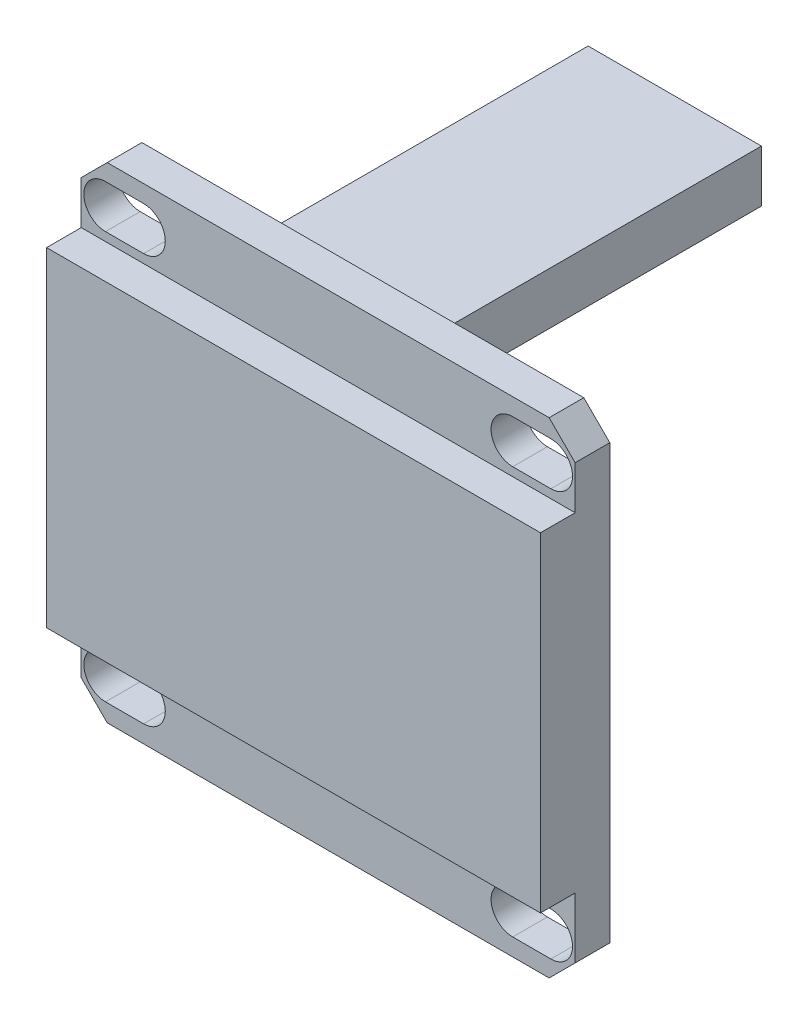
ISO-10303-21;
HEADER;
FILE_DESCRIPTION(('STEP AP214'),'2;1');
FILE_NAME('part.step','',(''),(''),'','','');
FILE_SCHEMA(('AUTOMOTIVE_DESIGN { 1 0 10303 214 1 1 1 1 }'));
ENDSEC;
DATA;
#1=APPLICATION_CONTEXT('core data for automotive mechanical design processes');
#2=APPLICATION_PROTOCOL_DEFINITION('international standard','automotive_design',2000,#1);
#3=PRODUCT_CONTEXT('',#1,'mechanical');
#4=PRODUCT('Part','Part','',(#3));
#5=PRODUCT_RELATED_PRODUCT_CATEGORY('part','',(#4));
#6=PRODUCT_DEFINITION_FORMATION('','',#4);
#7=PRODUCT_DEFINITION_CONTEXT('part definition',#1,'design');
#8=PRODUCT_DEFINITION('design','',#6,#7);
#9=PRODUCT_DEFINITION_SHAPE('','',#8);
#10=(LENGTH_UNIT() NAMED_UNIT(*) SI_UNIT(.MILLI.,.METRE.));
#11=(NAMED_UNIT(*) PLANE_ANGLE_UNIT() SI_UNIT($,.RADIAN.));
#12=(NAMED_UNIT(*) SI_UNIT($,.STERADIAN.) SOLID_ANGLE_UNIT());
#13=UNCERTAINTY_MEASURE_WITH_UNIT(LENGTH_MEASURE(1.E-05),#10,'distance_accuracy_value','');
#14=(GEOMETRIC_REPRESENTATION_CONTEXT(3) GLOBAL_UNCERTAINTY_ASSIGNED_CONTEXT((#13)) GLOBAL_UNIT_ASSIGNED_CONTEXT((#10,
#11,#12)) REPRESENTATION_CONTEXT('',''));
#15=CARTESIAN_POINT('',(0.,0.,0.));
#16=DIRECTION('',(0.,0.,1.));
#17=DIRECTION('',(1.,0.,0.));
#18=AXIS2_PLACEMENT_3D('',#15,#16,#17);
#19=CARTESIAN_POINT('',(-25.2500001639128,5.36363649774681,0.));
#20=DIRECTION('',(0.,0.,1.));
#21=DIRECTION('',(1.,0.,0.));
#22=AXIS2_PLACEMENT_3D('',#19,#20,#21);
#23=PLANE('',#22);
#24=CARTESIAN_POINT('',(-38.1000001639128,17.1136364977468,0.));
#25=DIRECTION('',(0.,0.,1.));
#26=DIRECTION('',(0.,1.,0.));
#27=AXIS2_PLACEMENT_3D('',#24,#25,#26);
#28=CIRCLE('',#27,1.25);
#29=CARTESIAN_POINT('',(-38.1000001639128,18.3636364977468,0.));
#30=VERTEX_POINT('',#29);
#31=CARTESIAN_POINT('',(-38.1000001639128,15.8636364977468,0.));
#32=VERTEX_POINT('',#31);
#33=EDGE_CURVE('E351',#30,#32,#28,.T.);
#34=ORIENTED_EDGE('',*,*,#33,.T.);
#35=DIRECTION('',(1.,0.,0.));
#36=VECTOR('',#35,1.);
#37=CARTESIAN_POINT('',(-30.5750001639128,15.8636364977468,0.));
#38=LINE('',#37,#36);
#39=CARTESIAN_POINT('',(-35.9000001639128,15.8636364977468,0.));
#40=VERTEX_POINT('',#39);
#41=EDGE_CURVE('E325',#32,#40,#38,.T.);
#42=ORIENTED_EDGE('',*,*,#41,.T.);
#43=CARTESIAN_POINT('',(-35.9000001639128,17.1136364977468,0.));
#44=DIRECTION('',(0.,0.,1.));
#45=DIRECTION('',(0.,-1.,0.));
#46=AXIS2_PLACEMENT_3D('',#43,#44,#45);
#47=CIRCLE('',#46,1.25);
#48=CARTESIAN_POINT('',(-35.9000001639128,18.3636364977468,0.));
#49=VERTEX_POINT('',#48);
#50=EDGE_CURVE('E271',#40,#49,#47,.T.);
#51=ORIENTED_EDGE('',*,*,#50,.T.);
#52=DIRECTION('',(-1.,0.,0.));
#53=VECTOR('',#52,1.);
#54=CARTESIAN_POINT('',(-31.6750001639128,18.3636364977468,0.));
#55=LINE('',#54,#53);
#56=EDGE_CURVE('E268',#49,#30,#55,.T.);
#57=ORIENTED_EDGE('',*,*,#56,.T.);
#58=EDGE_LOOP('',(#34,#42,#51,#57));
#59=FACE_BOUND('',#58,.T.);
#60=CARTESIAN_POINT('',(-38.1000001639128,-6.38636350225319,0.));
#61=DIRECTION('',(0.,0.,1.));
#62=DIRECTION('',(0.,1.,0.));
#63=AXIS2_PLACEMENT_3D('',#60,#61,#62);
#64=CIRCLE('',#63,1.25);
#65=CARTESIAN_POINT('',(-38.1000001639128,-5.13636350225319,0.));
#66=VERTEX_POINT('',#65);
#67=CARTESIAN_POINT('',(-38.1000001639128,-7.63636350225319,0.));
#68=VERTEX_POINT('',#67);
#69=EDGE_CURVE('E289',#66,#68,#64,.T.);
#70=ORIENTED_EDGE('',*,*,#69,.T.);
#71=DIRECTION('',(1.,0.,0.));
#72=VECTOR('',#71,1.);
#73=CARTESIAN_POINT('',(-30.5750001639128,-7.63636350225319,0.));
#74=LINE('',#73,#72);
#75=CARTESIAN_POINT('',(-35.9000001639128,-7.63636350225319,0.));
#76=VERTEX_POINT('',#75);
#77=EDGE_CURVE('E287',#68,#76,#74,.T.);
#78=ORIENTED_EDGE('',*,*,#77,.T.);
#79=CARTESIAN_POINT('',(-35.9000001639128,-6.38636350225319,0.));
#80=DIRECTION('',(0.,0.,1.));
#81=DIRECTION('',(0.,-1.,0.));
#82=AXIS2_PLACEMENT_3D('',#79,#80,#81);
#83=CIRCLE('',#82,1.25);
#84=CARTESIAN_POINT('',(-35.9000001639128,-5.13636350225319,0.));
#85=VERTEX_POINT('',#84);
#86=EDGE_CURVE('E290',#76,#85,#83,.T.);
#87=ORIENTED_EDGE('',*,*,#86,.T.);
#88=DIRECTION('',(-1.,0.,0.));
#89=VECTOR('',#88,1.);
#90=CARTESIAN_POINT('',(-31.6750001639128,-5.13636350225319,0.));
#91=LINE('',#90,#89);
#92=EDGE_CURVE('E319',#85,#66,#91,.T.);
#93=ORIENTED_EDGE('',*,*,#92,.T.);
#94=EDGE_LOOP('',(#70,#78,#87,#93));
#95=FACE_BOUND('',#94,.T.);
#96=CARTESIAN_POINT('',(-14.6000001639128,17.1136364977468,0.));
#97=DIRECTION('',(0.,0.,1.));
#98=DIRECTION('',(0.,1.,0.));
#99=AXIS2_PLACEMENT_3D('',#96,#97,#98);
#100=CIRCLE('',#99,1.25);
#101=CARTESIAN_POINT('',(-14.6000001639128,18.3636364977468,0.));
#102=VERTEX_POINT('',#101);
#103=CARTESIAN_POINT('',(-14.6000001639128,15.8636364977468,0.));
#104=VERTEX_POINT('',#103);
#105=EDGE_CURVE('E454',#102,#104,#100,.T.);
#106=ORIENTED_EDGE('',*,*,#105,.T.);
#107=DIRECTION('',(1.,0.,0.));
#108=VECTOR('',#107,1.);
#109=CARTESIAN_POINT('',(-18.8250001639128,15.8636364977468,0.));
#110=LINE('',#109,#108);
#111=CARTESIAN_POINT('',(-12.4000001639128,15.8636364977468,0.));
#112=VERTEX_POINT('',#111);
#113=EDGE_CURVE('E425',#104,#112,#110,.T.);
#114=ORIENTED_EDGE('',*,*,#113,.T.);
#115=CARTESIAN_POINT('',(-12.4000001639128,17.1136364977468,0.));
#116=DIRECTION('',(0.,0.,1.));
#117=DIRECTION('',(0.,-1.,0.));
#118=AXIS2_PLACEMENT_3D('',#115,#116,#117);
#119=CIRCLE('',#118,1.25);
#120=CARTESIAN_POINT('',(-12.4000001639128,18.3636364977468,0.));
#121=VERTEX_POINT('',#120);
#122=EDGE_CURVE('E423',#112,#121,#119,.T.);
#123=ORIENTED_EDGE('',*,*,#122,.T.);
#124=DIRECTION('',(-1.,0.,0.));
#125=VECTOR('',#124,1.);
#126=CARTESIAN_POINT('',(-19.9250001639128,18.3636364977468,0.));
#127=LINE('',#126,#125);
#128=EDGE_CURVE('E348',#121,#102,#127,.T.);
#129=ORIENTED_EDGE('',*,*,#128,.T.);
#130=EDGE_LOOP('',(#106,#114,#123,#129));
#131=FACE_BOUND('',#130,.T.);
#132=DIRECTION('',(1.,0.,0.));
#133=VECTOR('',#132,1.);
#134=CARTESIAN_POINT('',(-18.8250001639128,-7.63636350225319,0.));
#135=LINE('',#134,#133);
#136=CARTESIAN_POINT('',(-14.6000001639128,-7.63636350225319,0.));
#137=VERTEX_POINT('',#136);
#138=CARTESIAN_POINT('',(-12.4000001639128,-7.63636350225319,0.));
#139=VERTEX_POINT('',#138);
#140=EDGE_CURVE('E304',#137,#139,#135,.T.);
#141=ORIENTED_EDGE('',*,*,#140,.T.);
#142=CARTESIAN_POINT('',(-12.4000001639128,-6.38636350225319,0.));
#143=DIRECTION('',(0.,0.,1.));
#144=DIRECTION('',(0.,-1.,0.));
#145=AXIS2_PLACEMENT_3D('',#142,#143,#144);
#146=CIRCLE('',#145,1.25);
#147=CARTESIAN_POINT('',(-12.4000001639128,-5.13636350225319,0.));
#148=VERTEX_POINT('',#147);
#149=EDGE_CURVE('E388',#139,#148,#146,.T.);
#150=ORIENTED_EDGE('',*,*,#149,.T.);
#151=DIRECTION('',(-1.,0.,0.));
#152=VECTOR('',#151,1.);
#153=CARTESIAN_POINT('',(-19.9250001639128,-5.13636350225319,0.));
#154=LINE('',#153,#152);
#155=CARTESIAN_POINT('',(-14.6000001639128,-5.13636350225319,0.));
#156=VERTEX_POINT('',#155);
#157=EDGE_CURVE('E390',#148,#156,#154,.T.);
#158=ORIENTED_EDGE('',*,*,#157,.T.);
#159=CARTESIAN_POINT('',(-14.6000001639128,-6.38636350225319,0.));
#160=DIRECTION('',(0.,0.,1.));
#161=DIRECTION('',(0.,1.,0.));
#162=AXIS2_PLACEMENT_3D('',#159,#160,#161);
#163=CIRCLE('',#162,1.25);
#164=EDGE_CURVE('E448',#156,#137,#163,.T.);
#165=ORIENTED_EDGE('',*,*,#164,.T.);
#166=EDGE_LOOP('',(#141,#150,#158,#165));
#167=FACE_BOUND('',#166,.T.);
#168=DIRECTION('',(0.707106781186547,-0.707106781186548,0.));
#169=VECTOR('',#168,1.);
#170=CARTESIAN_POINT('',(-39.5000001639128,-7.13636350225319,0.));
#171=LINE('',#170,#169);
#172=CARTESIAN_POINT('',(-39.5000001639128,-7.13636350225319,0.));
#173=VERTEX_POINT('',#172);
#174=CARTESIAN_POINT('',(-38.0000001639128,-8.63636350225319,0.));
#175=VERTEX_POINT('',#174);
#176=EDGE_CURVE('E285',#173,#175,#171,.T.);
#177=ORIENTED_EDGE('',*,*,#176,.F.);
#178=DIRECTION('',(0.,1.,0.));
#179=VECTOR('',#178,1.);
#180=CARTESIAN_POINT('',(-39.5000001639128,-7.13636350225319,0.));
#181=LINE('',#180,#179);
#182=CARTESIAN_POINT('',(-39.5000001639128,17.8636364977468,0.));
#183=VERTEX_POINT('',#182);
#184=EDGE_CURVE('E286',#173,#183,#181,.T.);
#185=ORIENTED_EDGE('',*,*,#184,.T.);
#186=DIRECTION('',(-0.707106781186547,-0.707106781186549,0.));
#187=VECTOR('',#186,1.);
#188=CARTESIAN_POINT('',(-38.0000001639128,19.3636364977468,0.));
#189=LINE('',#188,#187);
#190=CARTESIAN_POINT('',(-38.0000001639128,19.3636364977468,0.));
#191=VERTEX_POINT('',#190);
#192=EDGE_CURVE('E280',#191,#183,#189,.T.);
#193=ORIENTED_EDGE('',*,*,#192,.F.);
#194=DIRECTION('',(1.,0.,0.));
#195=VECTOR('',#194,1.);
#196=CARTESIAN_POINT('',(-38.0000001639128,19.3636364977468,0.));
#197=LINE('',#196,#195);
#198=CARTESIAN_POINT('',(-12.5000001639128,19.3636364977468,0.));
#199=VERTEX_POINT('',#198);
#200=EDGE_CURVE('E40',#191,#199,#197,.T.);
#201=ORIENTED_EDGE('',*,*,#200,.T.);
#202=DIRECTION('',(0.707106781186548,-0.707106781186547,0.));
#203=VECTOR('',#202,1.);
#204=CARTESIAN_POINT('',(-12.5000001639128,19.3636364977468,0.));
#205=LINE('',#204,#203);
#206=CARTESIAN_POINT('',(-11.0000001639128,17.8636364977468,0.));
#207=VERTEX_POINT('',#206);
#208=EDGE_CURVE('E398',#199,#207,#205,.T.);
#209=ORIENTED_EDGE('',*,*,#208,.T.);
#210=DIRECTION('',(0.,-1.,0.));
#211=VECTOR('',#210,1.);
#212=CARTESIAN_POINT('',(-11.0000001639128,17.8636364977468,0.));
#213=LINE('',#212,#211);
#214=CARTESIAN_POINT('',(-11.0000001639128,-7.13636350225319,0.));
#215=VERTEX_POINT('',#214);
#216=EDGE_CURVE('E303',#207,#215,#213,.T.);
#217=ORIENTED_EDGE('',*,*,#216,.T.);
#218=DIRECTION('',(0.707106781186548,0.707106781186547,0.));
#219=VECTOR('',#218,1.);
#220=CARTESIAN_POINT('',(-12.5000001639128,-8.63636350225319,0.));
#221=LINE('',#220,#219);
#222=CARTESIAN_POINT('',(-12.5000001639128,-8.63636350225319,0.));
#223=VERTEX_POINT('',#222);
#224=EDGE_CURVE('E320',#223,#215,#221,.T.);
#225=ORIENTED_EDGE('',*,*,#224,.F.);
#226=DIRECTION('',(-1.,0.,0.));
#227=VECTOR('',#226,1.);
#228=CARTESIAN_POINT('',(-12.5000001639128,-8.63636350225319,0.));
#229=LINE('',#228,#227);
#230=EDGE_CURVE('E301',#223,#175,#229,.T.);
#231=ORIENTED_EDGE('',*,*,#230,.T.);
#232=EDGE_LOOP('',(#177,#185,#193,#201,#209,#217,#225,#231));
#233=FACE_BOUND('',#232,.T.);
#234=DIRECTION('',(0.,-1.,0.));
#235=VECTOR('',#234,1.);
#236=CARTESIAN_POINT('',(-20.2500001639128,19.0636364977468,0.));
#237=LINE('',#236,#235);
#238=CARTESIAN_POINT('',(-20.2500001639128,19.0636364977468,0.));
#239=VERTEX_POINT('',#238);
#240=CARTESIAN_POINT('',(-20.2500001639128,16.0636364977468,0.));
#241=VERTEX_POINT('',#240);
#242=EDGE_CURVE('E267',#239,#241,#237,.T.);
#243=ORIENTED_EDGE('',*,*,#242,.F.);
#244=DIRECTION('',(1.,0.,0.));
#245=VECTOR('',#244,1.);
#246=CARTESIAN_POINT('',(-20.2500001639128,19.0636364977468,0.));
#247=LINE('',#246,#245);
#248=CARTESIAN_POINT('',(-30.2500001639128,19.0636364977468,0.));
#249=VERTEX_POINT('',#248);
#250=EDGE_CURVE('E264',#249,#239,#247,.T.);
#251=ORIENTED_EDGE('',*,*,#250,.F.);
#252=DIRECTION('',(0.,1.,0.));
#253=VECTOR('',#252,1.);
#254=CARTESIAN_POINT('',(-30.2500001639128,19.0636364977468,0.));
#255=LINE('',#254,#253);
#256=CARTESIAN_POINT('',(-30.2500001639128,16.0636364977468,0.));
#257=VERTEX_POINT('',#256);
#258=EDGE_CURVE('E58',#257,#249,#255,.T.);
#259=ORIENTED_EDGE('',*,*,#258,.F.);
#260=DIRECTION('',(-1.,0.,0.));
#261=VECTOR('',#260,1.);
#262=CARTESIAN_POINT('',(-20.2500001639128,16.0636364977468,0.));
#263=LINE('',#262,#261);
#264=EDGE_CURVE('E53',#241,#257,#263,.T.);
#265=ORIENTED_EDGE('',*,*,#264,.F.);
#266=EDGE_LOOP('',(#243,#251,#259,#265));
#267=FACE_BOUND('',#266,.T.);
#268=ADVANCED_FACE('F36',(#59,#95,#131,#167,#233,#267),#23,.F.);
#269=CARTESIAN_POINT('',(-12.4000001639128,-7.63636350225319,2.));
#270=DIRECTION('',(0.,-1.,0.));
#271=DIRECTION('',(0.,0.,-1.));
#272=AXIS2_PLACEMENT_3D('',#269,#270,#271);
#273=PLANE('',#272);
#274=ORIENTED_EDGE('',*,*,#140,.F.);
#275=DIRECTION('',(0.,0.,-1.));
#276=VECTOR('',#275,1.);
#277=CARTESIAN_POINT('',(-14.6000001639128,-7.63636350225319,2.));
#278=LINE('',#277,#276);
#279=CARTESIAN_POINT('',(-14.6000001639128,-7.63636350225319,2.));
#280=VERTEX_POINT('',#279);
#281=EDGE_CURVE('E308',#280,#137,#278,.T.);
#282=ORIENTED_EDGE('',*,*,#281,.F.);
#283=DIRECTION('',(-1.,0.,0.));
#284=VECTOR('',#283,1.);
#285=CARTESIAN_POINT('',(-18.8250001639128,-7.63636350225319,2.));
#286=LINE('',#285,#284);
#287=CARTESIAN_POINT('',(-12.4000001639128,-7.63636350225319,2.));
#288=VERTEX_POINT('',#287);
#289=EDGE_CURVE('E376',#288,#280,#286,.T.);
#290=ORIENTED_EDGE('',*,*,#289,.F.);
#291=DIRECTION('',(0.,0.,-1.));
#292=VECTOR('',#291,1.);
#293=CARTESIAN_POINT('',(-12.4000001639128,-7.63636350225319,2.));
#294=LINE('',#293,#292);
#295=EDGE_CURVE('E11',#288,#139,#294,.T.);
#296=ORIENTED_EDGE('',*,*,#295,.T.);
#297=EDGE_LOOP('',(#274,#282,#290,#296));
#298=FACE_BOUND('',#297,.T.);
#299=ADVANCED_FACE('F523',(#298),#273,.F.);
#300=CARTESIAN_POINT('',(-12.4000001639128,-6.38636350225319,2.));
#301=DIRECTION('',(0.,0.,-1.));
#302=DIRECTION('',(0.,-1.,0.));
#303=AXIS2_PLACEMENT_3D('',#300,#301,#302);
#304=CYLINDRICAL_SURFACE('',#303,1.25);
#305=ORIENTED_EDGE('',*,*,#149,.F.);
#306=ORIENTED_EDGE('',*,*,#295,.F.);
#307=CARTESIAN_POINT('',(-12.4000001639128,-6.38636350225319,2.));
#308=DIRECTION('',(0.,0.,-1.));
#309=DIRECTION('',(0.,-1.,0.));
#310=AXIS2_PLACEMENT_3D('',#307,#308,#309);
#311=CIRCLE('',#310,1.25);
#312=CARTESIAN_POINT('',(-12.4000001639128,-5.13636350225319,2.));
#313=VERTEX_POINT('',#312);
#314=EDGE_CURVE('E330',#313,#288,#311,.T.);
#315=ORIENTED_EDGE('',*,*,#314,.F.);
#316=DIRECTION('',(0.,0.,-1.));
#317=VECTOR('',#316,1.);
#318=CARTESIAN_POINT('',(-12.4000001639128,-5.13636350225319,2.));
#319=LINE('',#318,#317);
#320=EDGE_CURVE('E45',#313,#148,#319,.T.);
#321=ORIENTED_EDGE('',*,*,#320,.T.);
#322=EDGE_LOOP('',(#305,#306,#315,#321));
#323=FACE_BOUND('',#322,.T.);
#324=ADVANCED_FACE('F528',(#323),#304,.F.);
#325=CARTESIAN_POINT('',(-14.6000001639128,-5.13636350225319,2.));
#326=DIRECTION('',(0.,1.,0.));
#327=DIRECTION('',(1.,0.,0.));
#328=AXIS2_PLACEMENT_3D('',#325,#326,#327);
#329=PLANE('',#328);
#330=ORIENTED_EDGE('',*,*,#157,.F.);
#331=ORIENTED_EDGE('',*,*,#320,.F.);
#332=DIRECTION('',(1.,0.,0.));
#333=VECTOR('',#332,1.);
#334=CARTESIAN_POINT('',(-19.9250001639128,-5.13636350225319,2.));
#335=LINE('',#334,#333);
#336=CARTESIAN_POINT('',(-14.6000001639128,-5.13636350225319,2.));
#337=VERTEX_POINT('',#336);
#338=EDGE_CURVE('E333',#337,#313,#335,.T.);
#339=ORIENTED_EDGE('',*,*,#338,.F.);
#340=DIRECTION('',(0.,0.,-1.));
#341=VECTOR('',#340,1.);
#342=CARTESIAN_POINT('',(-14.6000001639128,-5.13636350225319,2.));
#343=LINE('',#342,#341);
#344=EDGE_CURVE('E310',#337,#156,#343,.T.);
#345=ORIENTED_EDGE('',*,*,#344,.T.);
#346=EDGE_LOOP('',(#330,#331,#339,#345));
#347=FACE_BOUND('',#346,.T.);
#348=ADVANCED_FACE('F547',(#347),#329,.F.);
#349=CARTESIAN_POINT('',(-14.6000001639128,-6.38636350225319,2.));
#350=DIRECTION('',(0.,0.,-1.));
#351=DIRECTION('',(0.,1.,0.));
#352=AXIS2_PLACEMENT_3D('',#349,#350,#351);
#353=CYLINDRICAL_SURFACE('',#352,1.25);
#354=ORIENTED_EDGE('',*,*,#164,.F.);
#355=ORIENTED_EDGE('',*,*,#344,.F.);
#356=CARTESIAN_POINT('',(-14.6000001639128,-6.38636350225319,2.));
#357=DIRECTION('',(0.,0.,-1.));
#358=DIRECTION('',(0.,1.,0.));
#359=AXIS2_PLACEMENT_3D('',#356,#357,#358);
#360=CIRCLE('',#359,1.25);
#361=EDGE_CURVE('E373',#280,#337,#360,.T.);
#362=ORIENTED_EDGE('',*,*,#361,.F.);
#363=ORIENTED_EDGE('',*,*,#281,.T.);
#364=EDGE_LOOP('',(#354,#355,#362,#363));
#365=FACE_BOUND('',#364,.T.);
#366=ADVANCED_FACE('F585',(#365),#353,.F.);
#367=CARTESIAN_POINT('',(-14.6000001639128,17.1136364977468,2.));
#368=DIRECTION('',(0.,0.,-1.));
#369=DIRECTION('',(0.,1.,0.));
#370=AXIS2_PLACEMENT_3D('',#367,#368,#369);
#371=CYLINDRICAL_SURFACE('',#370,1.25);
#372=ORIENTED_EDGE('',*,*,#105,.F.);
#373=DIRECTION('',(0.,0.,-1.));
#374=VECTOR('',#373,1.);
#375=CARTESIAN_POINT('',(-14.6000001639128,18.3636364977468,2.));
#376=LINE('',#375,#374);
#377=CARTESIAN_POINT('',(-14.6000001639128,18.3636364977468,2.));
#378=VERTEX_POINT('',#377);
#379=EDGE_CURVE('E364',#378,#102,#376,.T.);
#380=ORIENTED_EDGE('',*,*,#379,.F.);
#381=CARTESIAN_POINT('',(-14.6000001639128,17.1136364977468,2.));
#382=DIRECTION('',(0.,0.,-1.));
#383=DIRECTION('',(0.,1.,0.));
#384=AXIS2_PLACEMENT_3D('',#381,#382,#383);
#385=CIRCLE('',#384,1.25);
#386=CARTESIAN_POINT('',(-14.6000001639128,15.8636364977468,2.));
#387=VERTEX_POINT('',#386);
#388=EDGE_CURVE('E391',#387,#378,#385,.T.);
#389=ORIENTED_EDGE('',*,*,#388,.F.);
#390=DIRECTION('',(0.,0.,-1.));
#391=VECTOR('',#390,1.);
#392=CARTESIAN_POINT('',(-14.6000001639128,15.8636364977468,2.));
#393=LINE('',#392,#391);
#394=EDGE_CURVE('E311',#387,#104,#393,.T.);
#395=ORIENTED_EDGE('',*,*,#394,.T.);
#396=EDGE_LOOP('',(#372,#380,#389,#395));
#397=FACE_BOUND('',#396,.T.);
#398=ADVANCED_FACE('F579',(#397),#371,.F.);
#399=CARTESIAN_POINT('',(-12.4000001639128,15.8636364977468,2.));
#400=DIRECTION('',(0.,-1.,0.));
#401=DIRECTION('',(0.,0.,-1.));
#402=AXIS2_PLACEMENT_3D('',#399,#400,#401);
#403=PLANE('',#402);
#404=ORIENTED_EDGE('',*,*,#113,.F.);
#405=ORIENTED_EDGE('',*,*,#394,.F.);
#406=DIRECTION('',(-1.,0.,0.));
#407=VECTOR('',#406,1.);
#408=CARTESIAN_POINT('',(-18.8250001639128,15.8636364977468,2.));
#409=LINE('',#408,#407);
#410=CARTESIAN_POINT('',(-12.4000001639128,15.8636364977468,2.));
#411=VERTEX_POINT('',#410);
#412=EDGE_CURVE('E419',#411,#387,#409,.T.);
#413=ORIENTED_EDGE('',*,*,#412,.F.);
#414=DIRECTION('',(0.,0.,-1.));
#415=VECTOR('',#414,1.);
#416=CARTESIAN_POINT('',(-12.4000001639128,15.8636364977468,2.));
#417=LINE('',#416,#415);
#418=EDGE_CURVE('E335',#411,#112,#417,.T.);
#419=ORIENTED_EDGE('',*,*,#418,.T.);
#420=EDGE_LOOP('',(#404,#405,#413,#419));
#421=FACE_BOUND('',#420,.T.);
#422=ADVANCED_FACE('F537',(#421),#403,.F.);
#423=CARTESIAN_POINT('',(-12.4000001639128,17.1136364977468,2.));
#424=DIRECTION('',(0.,0.,-1.));
#425=DIRECTION('',(0.,-1.,0.));
#426=AXIS2_PLACEMENT_3D('',#423,#424,#425);
#427=CYLINDRICAL_SURFACE('',#426,1.25);
#428=ORIENTED_EDGE('',*,*,#122,.F.);
#429=ORIENTED_EDGE('',*,*,#418,.F.);
#430=CARTESIAN_POINT('',(-12.4000001639128,17.1136364977468,2.));
#431=DIRECTION('',(0.,0.,-1.));
#432=DIRECTION('',(0.,-1.,0.));
#433=AXIS2_PLACEMENT_3D('',#430,#431,#432);
#434=CIRCLE('',#433,1.25);
#435=CARTESIAN_POINT('',(-12.4000001639128,18.3636364977468,2.));
#436=VERTEX_POINT('',#435);
#437=EDGE_CURVE('E411',#436,#411,#434,.T.);
#438=ORIENTED_EDGE('',*,*,#437,.F.);
#439=DIRECTION('',(0.,0.,-1.));
#440=VECTOR('',#439,1.);
#441=CARTESIAN_POINT('',(-12.4000001639128,18.3636364977468,2.));
#442=LINE('',#441,#440);
#443=EDGE_CURVE('E338',#436,#121,#442,.T.);
#444=ORIENTED_EDGE('',*,*,#443,.T.);
#445=EDGE_LOOP('',(#428,#429,#438,#444));
#446=FACE_BOUND('',#445,.T.);
#447=ADVANCED_FACE('F533',(#446),#427,.F.);
#448=CARTESIAN_POINT('',(-14.6000001639128,18.3636364977468,2.));
#449=DIRECTION('',(0.,1.,0.));
#450=DIRECTION('',(1.,0.,0.));
#451=AXIS2_PLACEMENT_3D('',#448,#449,#450);
#452=PLANE('',#451);
#453=ORIENTED_EDGE('',*,*,#128,.F.);
#454=ORIENTED_EDGE('',*,*,#443,.F.);
#455=DIRECTION('',(1.,0.,0.));
#456=VECTOR('',#455,1.);
#457=CARTESIAN_POINT('',(-19.9250001639128,18.3636364977468,2.));
#458=LINE('',#457,#456);
#459=EDGE_CURVE('E393',#378,#436,#458,.T.);
#460=ORIENTED_EDGE('',*,*,#459,.F.);
#461=ORIENTED_EDGE('',*,*,#379,.T.);
#462=EDGE_LOOP('',(#453,#454,#460,#461));
#463=FACE_BOUND('',#462,.T.);
#464=ADVANCED_FACE('F536',(#463),#452,.F.);
#465=CARTESIAN_POINT('',(-38.1000001639128,-6.38636350225319,2.));
#466=DIRECTION('',(0.,0.,-1.));
#467=DIRECTION('',(0.,1.,0.));
#468=AXIS2_PLACEMENT_3D('',#465,#466,#467);
#469=CYLINDRICAL_SURFACE('',#468,1.25);
#470=ORIENTED_EDGE('',*,*,#69,.F.);
#471=DIRECTION('',(0.,0.,-1.));
#472=VECTOR('',#471,1.);
#473=CARTESIAN_POINT('',(-38.1000001639128,-5.13636350225319,2.));
#474=LINE('',#473,#472);
#475=CARTESIAN_POINT('',(-38.1000001639128,-5.13636350225319,2.));
#476=VERTEX_POINT('',#475);
#477=EDGE_CURVE('E296',#476,#66,#474,.T.);
#478=ORIENTED_EDGE('',*,*,#477,.F.);
#479=CARTESIAN_POINT('',(-38.1000001639128,-6.38636350225319,2.));
#480=DIRECTION('',(0.,0.,-1.));
#481=DIRECTION('',(0.,1.,0.));
#482=AXIS2_PLACEMENT_3D('',#479,#480,#481);
#483=CIRCLE('',#482,1.25);
#484=CARTESIAN_POINT('',(-38.1000001639128,-7.63636350225319,2.));
#485=VERTEX_POINT('',#484);
#486=EDGE_CURVE('E334',#485,#476,#483,.T.);
#487=ORIENTED_EDGE('',*,*,#486,.F.);
#488=DIRECTION('',(0.,0.,-1.));
#489=VECTOR('',#488,1.);
#490=CARTESIAN_POINT('',(-38.1000001639128,-7.63636350225319,2.));
#491=LINE('',#490,#489);
#492=EDGE_CURVE('E422',#485,#68,#491,.T.);
#493=ORIENTED_EDGE('',*,*,#492,.T.);
#494=EDGE_LOOP('',(#470,#478,#487,#493));
#495=FACE_BOUND('',#494,.T.);
#496=ADVANCED_FACE('F559',(#495),#469,.F.);
#497=CARTESIAN_POINT('',(-35.9000001639128,-7.63636350225319,2.));
#498=DIRECTION('',(0.,-1.,0.));
#499=DIRECTION('',(0.,0.,-1.));
#500=AXIS2_PLACEMENT_3D('',#497,#498,#499);
#501=PLANE('',#500);
#502=ORIENTED_EDGE('',*,*,#77,.F.);
#503=ORIENTED_EDGE('',*,*,#492,.F.);
#504=DIRECTION('',(-1.,0.,0.));
#505=VECTOR('',#504,1.);
#506=CARTESIAN_POINT('',(-30.5750001639128,-7.63636350225319,2.));
#507=LINE('',#506,#505);
#508=CARTESIAN_POINT('',(-35.9000001639128,-7.63636350225319,2.));
#509=VERTEX_POINT('',#508);
#510=EDGE_CURVE('E377',#509,#485,#507,.T.);
#511=ORIENTED_EDGE('',*,*,#510,.F.);
#512=DIRECTION('',(0.,0.,-1.));
#513=VECTOR('',#512,1.);
#514=CARTESIAN_POINT('',(-35.9000001639128,-7.63636350225319,2.));
#515=LINE('',#514,#513);
#516=EDGE_CURVE('E396',#509,#76,#515,.T.);
#517=ORIENTED_EDGE('',*,*,#516,.T.);
#518=EDGE_LOOP('',(#502,#503,#511,#517));
#519=FACE_BOUND('',#518,.T.);
#520=ADVANCED_FACE('F564',(#519),#501,.F.);
#521=CARTESIAN_POINT('',(-35.9000001639128,-6.38636350225319,2.));
#522=DIRECTION('',(0.,0.,-1.));
#523=DIRECTION('',(0.,-1.,0.));
#524=AXIS2_PLACEMENT_3D('',#521,#522,#523);
#525=CYLINDRICAL_SURFACE('',#524,1.25);
#526=ORIENTED_EDGE('',*,*,#86,.F.);
#527=ORIENTED_EDGE('',*,*,#516,.F.);
#528=CARTESIAN_POINT('',(-35.9000001639128,-6.38636350225319,2.));
#529=DIRECTION('',(0.,0.,-1.));
#530=DIRECTION('',(0.,-1.,0.));
#531=AXIS2_PLACEMENT_3D('',#528,#529,#530);
#532=CIRCLE('',#531,1.25);
#533=CARTESIAN_POINT('',(-35.9000001639128,-5.13636350225319,2.));
#534=VERTEX_POINT('',#533);
#535=EDGE_CURVE('E380',#534,#509,#532,.T.);
#536=ORIENTED_EDGE('',*,*,#535,.F.);
#537=DIRECTION('',(0.,0.,-1.));
#538=VECTOR('',#537,1.);
#539=CARTESIAN_POINT('',(-35.9000001639128,-5.13636350225319,2.));
#540=LINE('',#539,#538);
#541=EDGE_CURVE('E299',#534,#85,#540,.T.);
#542=ORIENTED_EDGE('',*,*,#541,.T.);
#543=EDGE_LOOP('',(#526,#527,#536,#542));
#544=FACE_BOUND('',#543,.T.);
#545=ADVANCED_FACE('F649',(#544),#525,.F.);
#546=CARTESIAN_POINT('',(-38.1000001639128,-5.13636350225319,2.));
#547=DIRECTION('',(0.,1.,0.));
#548=DIRECTION('',(1.,0.,0.));
#549=AXIS2_PLACEMENT_3D('',#546,#547,#548);
#550=PLANE('',#549);
#551=ORIENTED_EDGE('',*,*,#92,.F.);
#552=ORIENTED_EDGE('',*,*,#541,.F.);
#553=DIRECTION('',(1.,0.,0.));
#554=VECTOR('',#553,1.);
#555=CARTESIAN_POINT('',(-31.6750001639128,-5.13636350225319,2.));
#556=LINE('',#555,#554);
#557=EDGE_CURVE('E429',#476,#534,#556,.T.);
#558=ORIENTED_EDGE('',*,*,#557,.F.);
#559=ORIENTED_EDGE('',*,*,#477,.T.);
#560=EDGE_LOOP('',(#551,#552,#558,#559));
#561=FACE_BOUND('',#560,.T.);
#562=ADVANCED_FACE('F518',(#561),#550,.F.);
#563=CARTESIAN_POINT('',(-38.1000001639128,17.1136364977468,2.));
#564=DIRECTION('',(0.,0.,-1.));
#565=DIRECTION('',(0.,1.,0.));
#566=AXIS2_PLACEMENT_3D('',#563,#564,#565);
#567=CYLINDRICAL_SURFACE('',#566,1.25);
#568=ORIENTED_EDGE('',*,*,#33,.F.);
#569=DIRECTION('',(0.,0.,-1.));
#570=VECTOR('',#569,1.);
#571=CARTESIAN_POINT('',(-38.1000001639128,18.3636364977468,2.));
#572=LINE('',#571,#570);
#573=CARTESIAN_POINT('',(-38.1000001639128,18.3636364977468,2.));
#574=VERTEX_POINT('',#573);
#575=EDGE_CURVE('E441',#574,#30,#572,.T.);
#576=ORIENTED_EDGE('',*,*,#575,.F.);
#577=CARTESIAN_POINT('',(-38.1000001639128,17.1136364977468,2.));
#578=DIRECTION('',(0.,0.,-1.));
#579=DIRECTION('',(0.,1.,0.));
#580=AXIS2_PLACEMENT_3D('',#577,#578,#579);
#581=CIRCLE('',#580,1.25);
#582=CARTESIAN_POINT('',(-38.1000001639128,15.8636364977468,2.));
#583=VERTEX_POINT('',#582);
#584=EDGE_CURVE('E435',#583,#574,#581,.T.);
#585=ORIENTED_EDGE('',*,*,#584,.F.);
#586=DIRECTION('',(0.,0.,-1.));
#587=VECTOR('',#586,1.);
#588=CARTESIAN_POINT('',(-38.1000001639128,15.8636364977468,2.));
#589=LINE('',#588,#587);
#590=EDGE_CURVE('E300',#583,#32,#589,.T.);
#591=ORIENTED_EDGE('',*,*,#590,.T.);
#592=EDGE_LOOP('',(#568,#576,#585,#591));
#593=FACE_BOUND('',#592,.T.);
#594=ADVANCED_FACE('F508',(#593),#567,.F.);
#595=CARTESIAN_POINT('',(-35.9000001639128,15.8636364977468,2.));
#596=DIRECTION('',(0.,-1.,0.));
#597=DIRECTION('',(0.,0.,-1.));
#598=AXIS2_PLACEMENT_3D('',#595,#596,#597);
#599=PLANE('',#598);
#600=ORIENTED_EDGE('',*,*,#41,.F.);
#601=ORIENTED_EDGE('',*,*,#590,.F.);
#602=DIRECTION('',(-1.,0.,0.));
#603=VECTOR('',#602,1.);
#604=CARTESIAN_POINT('',(-30.5750001639128,15.8636364977468,2.));
#605=LINE('',#604,#603);
#606=CARTESIAN_POINT('',(-35.9000001639128,15.8636364977468,2.));
#607=VERTEX_POINT('',#606);
#608=EDGE_CURVE('E369',#607,#583,#605,.T.);
#609=ORIENTED_EDGE('',*,*,#608,.F.);
#610=DIRECTION('',(0.,0.,-1.));
#611=VECTOR('',#610,1.);
#612=CARTESIAN_POINT('',(-35.9000001639128,15.8636364977468,2.));
#613=LINE('',#612,#611);
#614=EDGE_CURVE('E307',#607,#40,#613,.T.);
#615=ORIENTED_EDGE('',*,*,#614,.T.);
#616=EDGE_LOOP('',(#600,#601,#609,#615));
#617=FACE_BOUND('',#616,.T.);
#618=ADVANCED_FACE('F510',(#617),#599,.F.);
#619=CARTESIAN_POINT('',(-35.9000001639128,17.1136364977468,2.));
#620=DIRECTION('',(0.,0.,-1.));
#621=DIRECTION('',(0.,-1.,0.));
#622=AXIS2_PLACEMENT_3D('',#619,#620,#621);
#623=CYLINDRICAL_SURFACE('',#622,1.25);
#624=ORIENTED_EDGE('',*,*,#50,.F.);
#625=ORIENTED_EDGE('',*,*,#614,.F.);
#626=CARTESIAN_POINT('',(-35.9000001639128,17.1136364977468,2.));
#627=DIRECTION('',(0.,0.,-1.));
#628=DIRECTION('',(0.,-1.,0.));
#629=AXIS2_PLACEMENT_3D('',#626,#627,#628);
#630=CIRCLE('',#629,1.25);
#631=CARTESIAN_POINT('',(-35.9000001639128,18.3636364977468,2.));
#632=VERTEX_POINT('',#631);
#633=EDGE_CURVE('E365',#632,#607,#630,.T.);
#634=ORIENTED_EDGE('',*,*,#633,.F.);
#635=DIRECTION('',(0.,0.,-1.));
#636=VECTOR('',#635,1.);
#637=CARTESIAN_POINT('',(-35.9000001639128,18.3636364977468,2.));
#638=LINE('',#637,#636);
#639=EDGE_CURVE('E416',#632,#49,#638,.T.);
#640=ORIENTED_EDGE('',*,*,#639,.T.);
#641=EDGE_LOOP('',(#624,#625,#634,#640));
#642=FACE_BOUND('',#641,.T.);
#643=ADVANCED_FACE('F505',(#642),#623,.F.);
#644=CARTESIAN_POINT('',(-38.1000001639128,18.3636364977468,2.));
#645=DIRECTION('',(0.,1.,0.));
#646=DIRECTION('',(1.,0.,0.));
#647=AXIS2_PLACEMENT_3D('',#644,#645,#646);
#648=PLANE('',#647);
#649=ORIENTED_EDGE('',*,*,#56,.F.);
#650=ORIENTED_EDGE('',*,*,#639,.F.);
#651=DIRECTION('',(1.,0.,0.));
#652=VECTOR('',#651,1.);
#653=CARTESIAN_POINT('',(-31.6750001639128,18.3636364977468,2.));
#654=LINE('',#653,#652);
#655=EDGE_CURVE('E368',#574,#632,#654,.T.);
#656=ORIENTED_EDGE('',*,*,#655,.F.);
#657=ORIENTED_EDGE('',*,*,#575,.T.);
#658=EDGE_LOOP('',(#649,#650,#656,#657));
#659=FACE_BOUND('',#658,.T.);
#660=ADVANCED_FACE('F496',(#659),#648,.F.);
#661=CARTESIAN_POINT('',(-39.5000001639128,-3.63636350225319,2.));
#662=DIRECTION('',(0.,-1.,0.));
#663=DIRECTION('',(0.,0.,-1.));
#664=AXIS2_PLACEMENT_3D('',#661,#662,#663);
#665=PLANE('',#664);
#666=DIRECTION('',(-1.,0.,0.));
#667=VECTOR('',#666,1.);
#668=CARTESIAN_POINT('',(-32.3750001639128,-3.63636350225319,2.));
#669=LINE('',#668,#667);
#670=CARTESIAN_POINT('',(-11.0000001639128,-3.63636350225319,2.));
#671=VERTEX_POINT('',#670);
#672=CARTESIAN_POINT('',(-39.5000001639128,-3.63636350225319,2.));
#673=VERTEX_POINT('',#672);
#674=EDGE_CURVE('E346',#671,#673,#669,.T.);
#675=ORIENTED_EDGE('',*,*,#674,.F.);
#676=DIRECTION('',(0.,0.,1.));
#677=VECTOR('',#676,1.);
#678=CARTESIAN_POINT('',(-11.0000001639128,-3.63636350225319,2.));
#679=LINE('',#678,#677);
#680=CARTESIAN_POINT('',(-11.0000001639128,-3.63636350225319,4.));
#681=VERTEX_POINT('',#680);
#682=EDGE_CURVE('E404',#671,#681,#679,.T.);
#683=ORIENTED_EDGE('',*,*,#682,.T.);
#684=DIRECTION('',(1.,0.,0.));
#685=VECTOR('',#684,1.);
#686=CARTESIAN_POINT('',(-39.5000001639128,-3.63636350225319,4.));
#687=LINE('',#686,#685);
#688=CARTESIAN_POINT('',(-39.5000001639128,-3.63636350225319,4.));
#689=VERTEX_POINT('',#688);
#690=EDGE_CURVE('E343',#689,#681,#687,.T.);
#691=ORIENTED_EDGE('',*,*,#690,.F.);
#692=DIRECTION('',(0.,0.,1.));
#693=VECTOR('',#692,1.);
#694=CARTESIAN_POINT('',(-39.5000001639128,-3.63636350225319,2.));
#695=LINE('',#694,#693);
#696=EDGE_CURVE('E383',#673,#689,#695,.T.);
#697=ORIENTED_EDGE('',*,*,#696,.F.);
#698=EDGE_LOOP('',(#675,#683,#691,#697));
#699=FACE_BOUND('',#698,.T.);
#700=ADVANCED_FACE('F556',(#699),#665,.T.);
#701=CARTESIAN_POINT('',(-11.0000001639128,15.3636364977468,2.));
#702=DIRECTION('',(0.,1.,0.));
#703=DIRECTION('',(1.,0.,0.));
#704=AXIS2_PLACEMENT_3D('',#701,#702,#703);
#705=PLANE('',#704);
#706=DIRECTION('',(1.,0.,0.));
#707=VECTOR('',#706,1.);
#708=CARTESIAN_POINT('',(-18.1250001639128,15.3636364977468,2.));
#709=LINE('',#708,#707);
#710=CARTESIAN_POINT('',(-39.5000001639128,15.3636364977468,2.));
#711=VERTEX_POINT('',#710);
#712=CARTESIAN_POINT('',(-11.0000001639128,15.3636364977468,2.));
#713=VERTEX_POINT('',#712);
#714=EDGE_CURVE('E294',#711,#713,#709,.T.);
#715=ORIENTED_EDGE('',*,*,#714,.F.);
#716=DIRECTION('',(0.,0.,1.));
#717=VECTOR('',#716,1.);
#718=CARTESIAN_POINT('',(-39.5000001639128,15.3636364977468,2.));
#719=LINE('',#718,#717);
#720=CARTESIAN_POINT('',(-39.5000001639128,15.3636364977468,4.));
#721=VERTEX_POINT('',#720);
#722=EDGE_CURVE('E401',#711,#721,#719,.T.);
#723=ORIENTED_EDGE('',*,*,#722,.T.);
#724=DIRECTION('',(-1.,0.,0.));
#725=VECTOR('',#724,1.);
#726=CARTESIAN_POINT('',(-11.0000001639128,15.3636364977468,4.));
#727=LINE('',#726,#725);
#728=CARTESIAN_POINT('',(-11.0000001639128,15.3636364977468,4.));
#729=VERTEX_POINT('',#728);
#730=EDGE_CURVE('E437',#729,#721,#727,.T.);
#731=ORIENTED_EDGE('',*,*,#730,.F.);
#732=DIRECTION('',(0.,0.,1.));
#733=VECTOR('',#732,1.);
#734=CARTESIAN_POINT('',(-11.0000001639128,15.3636364977468,2.));
#735=LINE('',#734,#733);
#736=EDGE_CURVE('E323',#713,#729,#735,.T.);
#737=ORIENTED_EDGE('',*,*,#736,.F.);
#738=EDGE_LOOP('',(#715,#723,#731,#737));
#739=FACE_BOUND('',#738,.T.);
#740=ADVANCED_FACE('F553',(#739),#705,.T.);
#741=CARTESIAN_POINT('',(-25.2500001639128,5.86363649774681,4.));
#742=DIRECTION('',(0.,0.,1.));
#743=DIRECTION('',(1.,0.,0.));
#744=AXIS2_PLACEMENT_3D('',#741,#742,#743);
#745=PLANE('',#744);
#746=DIRECTION('',(0.,1.,0.));
#747=VECTOR('',#746,1.);
#748=CARTESIAN_POINT('',(-11.0000001639128,-3.63636350225319,4.));
#749=LINE('',#748,#747);
#750=EDGE_CURVE('E405',#681,#729,#749,.T.);
#751=ORIENTED_EDGE('',*,*,#750,.T.);
#752=ORIENTED_EDGE('',*,*,#730,.T.);
#753=DIRECTION('',(0.,-1.,0.));
#754=VECTOR('',#753,1.);
#755=CARTESIAN_POINT('',(-39.5000001639128,15.3636364977468,4.));
#756=LINE('',#755,#754);
#757=EDGE_CURVE('E345',#721,#689,#756,.T.);
#758=ORIENTED_EDGE('',*,*,#757,.T.);
#759=ORIENTED_EDGE('',*,*,#690,.T.);
#760=EDGE_LOOP('',(#751,#752,#758,#759));
#761=FACE_BOUND('',#760,.T.);
#762=ADVANCED_FACE('F555',(#761),#745,.T.);
#763=CARTESIAN_POINT('',(-25.2500001639128,5.36363649774681,2.));
#764=DIRECTION('',(0.,0.,1.));
#765=DIRECTION('',(1.,0.,0.));
#766=AXIS2_PLACEMENT_3D('',#763,#764,#765);
#767=PLANE('',#766);
#768=ORIENTED_EDGE('',*,*,#674,.T.);
#769=DIRECTION('',(0.,-1.,0.));
#770=VECTOR('',#769,1.);
#771=CARTESIAN_POINT('',(-39.5000001639128,-7.13636350225319,2.));
#772=LINE('',#771,#770);
#773=CARTESIAN_POINT('',(-39.5000001639128,-7.13636350225319,2.));
#774=VERTEX_POINT('',#773);
#775=EDGE_CURVE('E432',#673,#774,#772,.T.);
#776=ORIENTED_EDGE('',*,*,#775,.T.);
#777=DIRECTION('',(0.707106781186547,-0.707106781186548,0.));
#778=VECTOR('',#777,1.);
#779=CARTESIAN_POINT('',(-39.5000001639128,-7.13636350225319,2.));
#780=LINE('',#779,#778);
#781=CARTESIAN_POINT('',(-38.0000001639128,-8.63636350225319,2.));
#782=VERTEX_POINT('',#781);
#783=EDGE_CURVE('E359',#774,#782,#780,.T.);
#784=ORIENTED_EDGE('',*,*,#783,.T.);
#785=DIRECTION('',(1.,0.,0.));
#786=VECTOR('',#785,1.);
#787=CARTESIAN_POINT('',(-12.5000001639128,-8.63636350225319,2.));
#788=LINE('',#787,#786);
#789=CARTESIAN_POINT('',(-12.5000001639128,-8.63636350225319,2.));
#790=VERTEX_POINT('',#789);
#791=EDGE_CURVE('E355',#782,#790,#788,.T.);
#792=ORIENTED_EDGE('',*,*,#791,.T.);
#793=DIRECTION('',(0.707106781186548,0.707106781186547,0.));
#794=VECTOR('',#793,1.);
#795=CARTESIAN_POINT('',(-12.5000001639128,-8.63636350225319,2.));
#796=LINE('',#795,#794);
#797=CARTESIAN_POINT('',(-11.0000001639128,-7.13636350225319,2.));
#798=VERTEX_POINT('',#797);
#799=EDGE_CURVE('E352',#790,#798,#796,.T.);
#800=ORIENTED_EDGE('',*,*,#799,.T.);
#801=DIRECTION('',(0.,1.,0.));
#802=VECTOR('',#801,1.);
#803=CARTESIAN_POINT('',(-11.0000001639128,17.8636364977468,2.));
#804=LINE('',#803,#802);
#805=EDGE_CURVE('E356',#798,#671,#804,.T.);
#806=ORIENTED_EDGE('',*,*,#805,.T.);
#807=EDGE_LOOP('',(#768,#776,#784,#792,#800,#806));
#808=FACE_BOUND('',#807,.T.);
#809=ORIENTED_EDGE('',*,*,#289,.T.);
#810=ORIENTED_EDGE('',*,*,#361,.T.);
#811=ORIENTED_EDGE('',*,*,#338,.T.);
#812=ORIENTED_EDGE('',*,*,#314,.T.);
#813=EDGE_LOOP('',(#809,#810,#811,#812));
#814=FACE_BOUND('',#813,.T.);
#815=ORIENTED_EDGE('',*,*,#486,.T.);
#816=ORIENTED_EDGE('',*,*,#557,.T.);
#817=ORIENTED_EDGE('',*,*,#535,.T.);
#818=ORIENTED_EDGE('',*,*,#510,.T.);
#819=EDGE_LOOP('',(#815,#816,#817,#818));
#820=FACE_BOUND('',#819,.T.);
#821=ADVANCED_FACE('F600',(#808,#814,#820),#767,.T.);
#822=CARTESIAN_POINT('',(-25.2500001639128,5.36363649774681,2.));
#823=DIRECTION('',(0.,0.,1.));
#824=DIRECTION('',(1.,0.,0.));
#825=AXIS2_PLACEMENT_3D('',#822,#823,#824);
#826=PLANE('',#825);
#827=ORIENTED_EDGE('',*,*,#714,.T.);
#828=DIRECTION('',(0.,1.,0.));
#829=VECTOR('',#828,1.);
#830=CARTESIAN_POINT('',(-11.0000001639128,17.8636364977468,2.));
#831=LINE('',#830,#829);
#832=CARTESIAN_POINT('',(-11.0000001639128,17.8636364977468,2.));
#833=VERTEX_POINT('',#832);
#834=EDGE_CURVE('E291',#713,#833,#831,.T.);
#835=ORIENTED_EDGE('',*,*,#834,.T.);
#836=DIRECTION('',(-0.707106781186548,0.707106781186547,0.));
#837=VECTOR('',#836,1.);
#838=CARTESIAN_POINT('',(-12.5000001639128,19.3636364977468,2.));
#839=LINE('',#838,#837);
#840=CARTESIAN_POINT('',(-12.5000001639128,19.3636364977468,2.));
#841=VERTEX_POINT('',#840);
#842=EDGE_CURVE('E295',#833,#841,#839,.T.);
#843=ORIENTED_EDGE('',*,*,#842,.T.);
#844=DIRECTION('',(-1.,0.,0.));
#845=VECTOR('',#844,1.);
#846=CARTESIAN_POINT('',(-38.0000001639128,19.3636364977468,2.));
#847=LINE('',#846,#845);
#848=CARTESIAN_POINT('',(-38.0000001639128,19.3636364977468,2.));
#849=VERTEX_POINT('',#848);
#850=EDGE_CURVE('E316',#841,#849,#847,.T.);
#851=ORIENTED_EDGE('',*,*,#850,.T.);
#852=DIRECTION('',(-0.707106781186547,-0.707106781186549,0.));
#853=VECTOR('',#852,1.);
#854=CARTESIAN_POINT('',(-38.0000001639128,19.3636364977468,2.));
#855=LINE('',#854,#853);
#856=CARTESIAN_POINT('',(-39.5000001639128,17.8636364977468,2.));
#857=VERTEX_POINT('',#856);
#858=EDGE_CURVE('E313',#849,#857,#855,.T.);
#859=ORIENTED_EDGE('',*,*,#858,.T.);
#860=DIRECTION('',(0.,-1.,0.));
#861=VECTOR('',#860,1.);
#862=CARTESIAN_POINT('',(-39.5000001639128,-7.13636350225319,2.));
#863=LINE('',#862,#861);
#864=EDGE_CURVE('E317',#857,#711,#863,.T.);
#865=ORIENTED_EDGE('',*,*,#864,.T.);
#866=EDGE_LOOP('',(#827,#835,#843,#851,#859,#865));
#867=FACE_BOUND('',#866,.T.);
#868=ORIENTED_EDGE('',*,*,#388,.T.);
#869=ORIENTED_EDGE('',*,*,#459,.T.);
#870=ORIENTED_EDGE('',*,*,#437,.T.);
#871=ORIENTED_EDGE('',*,*,#412,.T.);
#872=EDGE_LOOP('',(#868,#869,#870,#871));
#873=FACE_BOUND('',#872,.T.);
#874=ORIENTED_EDGE('',*,*,#584,.T.);
#875=ORIENTED_EDGE('',*,*,#655,.T.);
#876=ORIENTED_EDGE('',*,*,#633,.T.);
#877=ORIENTED_EDGE('',*,*,#608,.T.);
#878=EDGE_LOOP('',(#874,#875,#876,#877));
#879=FACE_BOUND('',#878,.T.);
#880=ADVANCED_FACE('F38',(#867,#873,#879),#826,.T.);
#881=CARTESIAN_POINT('',(-39.5000001639128,17.8636364977468,0.));
#882=DIRECTION('',(-1.,0.,0.));
#883=DIRECTION('',(0.,0.,1.));
#884=AXIS2_PLACEMENT_3D('',#881,#882,#883);
#885=PLANE('',#884);
#886=ORIENTED_EDGE('',*,*,#184,.F.);
#887=DIRECTION('',(0.,0.,1.));
#888=VECTOR('',#887,1.);
#889=CARTESIAN_POINT('',(-39.5000001639128,-7.13636350225319,0.));
#890=LINE('',#889,#888);
#891=EDGE_CURVE('E385',#173,#774,#890,.T.);
#892=ORIENTED_EDGE('',*,*,#891,.T.);
#893=ORIENTED_EDGE('',*,*,#775,.F.);
#894=ORIENTED_EDGE('',*,*,#696,.T.);
#895=ORIENTED_EDGE('',*,*,#757,.F.);
#896=ORIENTED_EDGE('',*,*,#722,.F.);
#897=ORIENTED_EDGE('',*,*,#864,.F.);
#898=DIRECTION('',(0.,0.,1.));
#899=VECTOR('',#898,1.);
#900=CARTESIAN_POINT('',(-39.5000001639128,17.8636364977468,0.));
#901=LINE('',#900,#899);
#902=EDGE_CURVE('E277',#183,#857,#901,.T.);
#903=ORIENTED_EDGE('',*,*,#902,.F.);
#904=EDGE_LOOP('',(#886,#892,#893,#894,#895,#896,#897,#903));
#905=FACE_BOUND('',#904,.T.);
#906=ADVANCED_FACE('F596',(#905),#885,.T.);
#907=CARTESIAN_POINT('',(-38.0000001639128,19.3636364977468,0.));
#908=DIRECTION('',(-0.707106781186549,0.707106781186547,0.));
#909=DIRECTION('',(0.,0.,1.));
#910=AXIS2_PLACEMENT_3D('',#907,#908,#909);
#911=PLANE('',#910);
#912=ORIENTED_EDGE('',*,*,#192,.T.);
#913=ORIENTED_EDGE('',*,*,#902,.T.);
#914=ORIENTED_EDGE('',*,*,#858,.F.);
#915=DIRECTION('',(0.,0.,1.));
#916=VECTOR('',#915,1.);
#917=CARTESIAN_POINT('',(-38.0000001639128,19.3636364977468,0.));
#918=LINE('',#917,#916);
#919=EDGE_CURVE('E281',#191,#849,#918,.T.);
#920=ORIENTED_EDGE('',*,*,#919,.F.);
#921=EDGE_LOOP('',(#912,#913,#914,#920));
#922=FACE_BOUND('',#921,.T.);
#923=ADVANCED_FACE('F592',(#922),#911,.T.);
#924=CARTESIAN_POINT('',(-12.5000001639128,19.3636364977468,0.));
#925=DIRECTION('',(0.,1.,0.));
#926=DIRECTION('',(1.,0.,0.));
#927=AXIS2_PLACEMENT_3D('',#924,#925,#926);
#928=PLANE('',#927);
#929=ORIENTED_EDGE('',*,*,#200,.F.);
#930=ORIENTED_EDGE('',*,*,#919,.T.);
#931=ORIENTED_EDGE('',*,*,#850,.F.);
#932=DIRECTION('',(0.,0.,1.));
#933=VECTOR('',#932,1.);
#934=CARTESIAN_POINT('',(-12.5000001639128,19.3636364977468,0.));
#935=LINE('',#934,#933);
#936=EDGE_CURVE('E342',#199,#841,#935,.T.);
#937=ORIENTED_EDGE('',*,*,#936,.F.);
#938=EDGE_LOOP('',(#929,#930,#931,#937));
#939=FACE_BOUND('',#938,.T.);
#940=ADVANCED_FACE('F595',(#939),#928,.T.);
#941=CARTESIAN_POINT('',(-11.0000001639128,17.8636364977468,0.));
#942=DIRECTION('',(0.707106781186547,0.707106781186548,0.));
#943=DIRECTION('',(0.,0.,-1.));
#944=AXIS2_PLACEMENT_3D('',#941,#942,#943);
#945=PLANE('',#944);
#946=ORIENTED_EDGE('',*,*,#208,.F.);
#947=ORIENTED_EDGE('',*,*,#936,.T.);
#948=ORIENTED_EDGE('',*,*,#842,.F.);
#949=DIRECTION('',(0.,0.,1.));
#950=VECTOR('',#949,1.);
#951=CARTESIAN_POINT('',(-11.0000001639128,17.8636364977468,0.));
#952=LINE('',#951,#950);
#953=EDGE_CURVE('E339',#207,#833,#952,.T.);
#954=ORIENTED_EDGE('',*,*,#953,.F.);
#955=EDGE_LOOP('',(#946,#947,#948,#954));
#956=FACE_BOUND('',#955,.T.);
#957=ADVANCED_FACE('F590',(#956),#945,.T.);
#958=CARTESIAN_POINT('',(-11.0000001639128,-7.13636350225318,0.));
#959=DIRECTION('',(1.,0.,0.));
#960=DIRECTION('',(0.,1.,0.));
#961=AXIS2_PLACEMENT_3D('',#958,#959,#960);
#962=PLANE('',#961);
#963=ORIENTED_EDGE('',*,*,#216,.F.);
#964=ORIENTED_EDGE('',*,*,#953,.T.);
#965=ORIENTED_EDGE('',*,*,#834,.F.);
#966=ORIENTED_EDGE('',*,*,#736,.T.);
#967=ORIENTED_EDGE('',*,*,#750,.F.);
#968=ORIENTED_EDGE('',*,*,#682,.F.);
#969=ORIENTED_EDGE('',*,*,#805,.F.);
#970=DIRECTION('',(0.,0.,1.));
#971=VECTOR('',#970,1.);
#972=CARTESIAN_POINT('',(-11.0000001639128,-7.13636350225319,0.));
#973=LINE('',#972,#971);
#974=EDGE_CURVE('E324',#215,#798,#973,.T.);
#975=ORIENTED_EDGE('',*,*,#974,.F.);
#976=EDGE_LOOP('',(#963,#964,#965,#966,#967,#968,#969,#975));
#977=FACE_BOUND('',#976,.T.);
#978=ADVANCED_FACE('F543',(#977),#962,.T.);
#979=CARTESIAN_POINT('',(-12.5000001639128,-8.63636350225319,0.));
#980=DIRECTION('',(0.707106781186547,-0.707106781186548,0.));
#981=DIRECTION('',(0.,0.,-1.));
#982=AXIS2_PLACEMENT_3D('',#979,#980,#981);
#983=PLANE('',#982);
#984=ORIENTED_EDGE('',*,*,#224,.T.);
#985=ORIENTED_EDGE('',*,*,#974,.T.);
#986=ORIENTED_EDGE('',*,*,#799,.F.);
#987=DIRECTION('',(0.,0.,1.));
#988=VECTOR('',#987,1.);
#989=CARTESIAN_POINT('',(-12.5000001639128,-8.63636350225319,0.));
#990=LINE('',#989,#988);
#991=EDGE_CURVE('E329',#223,#790,#990,.T.);
#992=ORIENTED_EDGE('',*,*,#991,.F.);
#993=EDGE_LOOP('',(#984,#985,#986,#992));
#994=FACE_BOUND('',#993,.T.);
#995=ADVANCED_FACE('F539',(#994),#983,.T.);
#996=CARTESIAN_POINT('',(-38.0000001639128,-8.63636350225319,0.));
#997=DIRECTION('',(0.,-1.,0.));
#998=DIRECTION('',(0.,0.,-1.));
#999=AXIS2_PLACEMENT_3D('',#996,#997,#998);
#1000=PLANE('',#999);
#1001=ORIENTED_EDGE('',*,*,#230,.F.);
#1002=ORIENTED_EDGE('',*,*,#991,.T.);
#1003=ORIENTED_EDGE('',*,*,#791,.F.);
#1004=DIRECTION('',(0.,0.,1.));
#1005=VECTOR('',#1004,1.);
#1006=CARTESIAN_POINT('',(-38.0000001639128,-8.63636350225319,0.));
#1007=LINE('',#1006,#1005);
#1008=EDGE_CURVE('E282',#175,#782,#1007,.T.);
#1009=ORIENTED_EDGE('',*,*,#1008,.F.);
#1010=EDGE_LOOP('',(#1001,#1002,#1003,#1009));
#1011=FACE_BOUND('',#1010,.T.);
#1012=ADVANCED_FACE('F542',(#1011),#1000,.T.);
#1013=CARTESIAN_POINT('',(-39.5000001639128,-7.13636350225319,0.));
#1014=DIRECTION('',(-0.707106781186548,-0.707106781186547,0.));
#1015=DIRECTION('',(-0.707106781186547,0.707106781186548,0.));
#1016=AXIS2_PLACEMENT_3D('',#1013,#1014,#1015);
#1017=PLANE('',#1016);
#1018=ORIENTED_EDGE('',*,*,#176,.T.);
#1019=ORIENTED_EDGE('',*,*,#1008,.T.);
#1020=ORIENTED_EDGE('',*,*,#783,.F.);
#1021=ORIENTED_EDGE('',*,*,#891,.F.);
#1022=EDGE_LOOP('',(#1018,#1019,#1020,#1021));
#1023=FACE_BOUND('',#1022,.T.);
#1024=ADVANCED_FACE('F549',(#1023),#1017,.T.);
#1025=CARTESIAN_POINT('',(-20.2500001639128,19.0636364977468,-18.));
#1026=DIRECTION('',(-1.,0.,0.));
#1027=DIRECTION('',(0.,0.,1.));
#1028=AXIS2_PLACEMENT_3D('',#1025,#1026,#1027);
#1029=PLANE('',#1028);
#1030=ORIENTED_EDGE('',*,*,#242,.T.);
#1031=DIRECTION('',(0.,0.,1.));
#1032=VECTOR('',#1031,1.);
#1033=CARTESIAN_POINT('',(-20.2500001639128,16.0636364977468,-18.));
#1034=LINE('',#1033,#1032);
#1035=CARTESIAN_POINT('',(-20.2500001639128,16.0636364977468,-18.));
#1036=VERTEX_POINT('',#1035);
#1037=EDGE_CURVE('E248',#1036,#241,#1034,.T.);
#1038=ORIENTED_EDGE('',*,*,#1037,.F.);
#1039=DIRECTION('',(0.,-1.,0.));
#1040=VECTOR('',#1039,1.);
#1041=CARTESIAN_POINT('',(-20.2500001639128,19.0636364977468,-18.));
#1042=LINE('',#1041,#1040);
#1043=CARTESIAN_POINT('',(-20.2500001639128,19.0636364977468,-18.));
#1044=VERTEX_POINT('',#1043);
#1045=EDGE_CURVE('E255',#1044,#1036,#1042,.T.);
#1046=ORIENTED_EDGE('',*,*,#1045,.F.);
#1047=DIRECTION('',(0.,0.,1.));
#1048=VECTOR('',#1047,1.);
#1049=CARTESIAN_POINT('',(-20.2500001639128,19.0636364977468,-18.));
#1050=LINE('',#1049,#1048);
#1051=EDGE_CURVE('E911',#1044,#239,#1050,.T.);
#1052=ORIENTED_EDGE('',*,*,#1051,.T.);
#1053=EDGE_LOOP('',(#1030,#1038,#1046,#1052));
#1054=FACE_BOUND('',#1053,.T.);
#1055=ADVANCED_FACE('F266',(#1054),#1029,.F.);
#1056=CARTESIAN_POINT('',(-20.2500001639128,16.0636364977468,-18.));
#1057=DIRECTION('',(0.,1.,0.));
#1058=DIRECTION('',(-1.,0.,0.));
#1059=AXIS2_PLACEMENT_3D('',#1056,#1057,#1058);
#1060=PLANE('',#1059);
#1061=ORIENTED_EDGE('',*,*,#264,.T.);
#1062=DIRECTION('',(0.,0.,1.));
#1063=VECTOR('',#1062,1.);
#1064=CARTESIAN_POINT('',(-30.2500001639128,16.0636364977468,-18.));
#1065=LINE('',#1064,#1063);
#1066=CARTESIAN_POINT('',(-30.2500001639128,16.0636364977468,-18.));
#1067=VERTEX_POINT('',#1066);
#1068=EDGE_CURVE('E251',#1067,#257,#1065,.T.);
#1069=ORIENTED_EDGE('',*,*,#1068,.F.);
#1070=DIRECTION('',(-1.,0.,0.));
#1071=VECTOR('',#1070,1.);
#1072=CARTESIAN_POINT('',(-20.2500001639128,16.0636364977468,-18.));
#1073=LINE('',#1072,#1071);
#1074=EDGE_CURVE('E244',#1036,#1067,#1073,.T.);
#1075=ORIENTED_EDGE('',*,*,#1074,.F.);
#1076=ORIENTED_EDGE('',*,*,#1037,.T.);
#1077=EDGE_LOOP('',(#1061,#1069,#1075,#1076));
#1078=FACE_BOUND('',#1077,.T.);
#1079=ADVANCED_FACE('F246',(#1078),#1060,.F.);
#1080=CARTESIAN_POINT('',(-30.2500001639128,19.0636364977468,-18.));
#1081=DIRECTION('',(1.,0.,0.));
#1082=DIRECTION('',(0.,0.,-1.));
#1083=AXIS2_PLACEMENT_3D('',#1080,#1081,#1082);
#1084=PLANE('',#1083);
#1085=ORIENTED_EDGE('',*,*,#258,.T.);
#1086=DIRECTION('',(0.,0.,1.));
#1087=VECTOR('',#1086,1.);
#1088=CARTESIAN_POINT('',(-30.2500001639128,19.0636364977468,-18.));
#1089=LINE('',#1088,#1087);
#1090=CARTESIAN_POINT('',(-30.2500001639128,19.0636364977468,-18.));
#1091=VERTEX_POINT('',#1090);
#1092=EDGE_CURVE('E273',#1091,#249,#1089,.T.);
#1093=ORIENTED_EDGE('',*,*,#1092,.F.);
#1094=DIRECTION('',(0.,1.,0.));
#1095=VECTOR('',#1094,1.);
#1096=CARTESIAN_POINT('',(-30.2500001639128,19.0636364977468,-18.));
#1097=LINE('',#1096,#1095);
#1098=EDGE_CURVE('E254',#1067,#1091,#1097,.T.);
#1099=ORIENTED_EDGE('',*,*,#1098,.F.);
#1100=ORIENTED_EDGE('',*,*,#1068,.T.);
#1101=EDGE_LOOP('',(#1085,#1093,#1099,#1100));
#1102=FACE_BOUND('',#1101,.T.);
#1103=ADVANCED_FACE('F675',(#1102),#1084,.F.);
#1104=CARTESIAN_POINT('',(-20.2500001639128,19.0636364977468,-18.));
#1105=DIRECTION('',(0.,-1.,0.));
#1106=DIRECTION('',(0.,0.,-1.));
#1107=AXIS2_PLACEMENT_3D('',#1104,#1105,#1106);
#1108=PLANE('',#1107);
#1109=ORIENTED_EDGE('',*,*,#250,.T.);
#1110=ORIENTED_EDGE('',*,*,#1051,.F.);
#1111=DIRECTION('',(1.,0.,0.));
#1112=VECTOR('',#1111,1.);
#1113=CARTESIAN_POINT('',(-20.2500001639128,19.0636364977468,-18.));
#1114=LINE('',#1113,#1112);
#1115=EDGE_CURVE('E260',#1091,#1044,#1114,.T.);
#1116=ORIENTED_EDGE('',*,*,#1115,.F.);
#1117=ORIENTED_EDGE('',*,*,#1092,.T.);
#1118=EDGE_LOOP('',(#1109,#1110,#1116,#1117));
#1119=FACE_BOUND('',#1118,.T.);
#1120=ADVANCED_FACE('F682',(#1119),#1108,.F.);
#1121=CARTESIAN_POINT('',(0.,0.,-18.));
#1122=DIRECTION('',(0.,0.,-1.));
#1123=DIRECTION('',(-1.,0.,0.));
#1124=AXIS2_PLACEMENT_3D('',#1121,#1122,#1123);
#1125=PLANE('',#1124);
#1126=ORIENTED_EDGE('',*,*,#1045,.T.);
#1127=ORIENTED_EDGE('',*,*,#1074,.T.);
#1128=ORIENTED_EDGE('',*,*,#1098,.T.);
#1129=ORIENTED_EDGE('',*,*,#1115,.T.);
#1130=EDGE_LOOP('',(#1126,#1127,#1128,#1129));
#1131=FACE_BOUND('',#1130,.T.);
#1132=ADVANCED_FACE('F258',(#1131),#1125,.T.);
#1133=CLOSED_SHELL('',(#268,#299,#324,#348,#366,#398,#422,#447,#464,#496,#520,#545,#562,#594,
#618,#643,#660,#700,#740,#762,#821,#880,#906,#923,#940,#957,#978,#995,#1012,#1024,#1055,#1079,
#1103,#1120,#1132));
#1134=MANIFOLD_SOLID_BREP('B2',#1133);
#1135=ADVANCED_BREP_SHAPE_REPRESENTATION('',(#18,#1134),#14);
#1136=SHAPE_DEFINITION_REPRESENTATION(#9,#1135);
ENDSEC;
END-ISO-10303-21;
